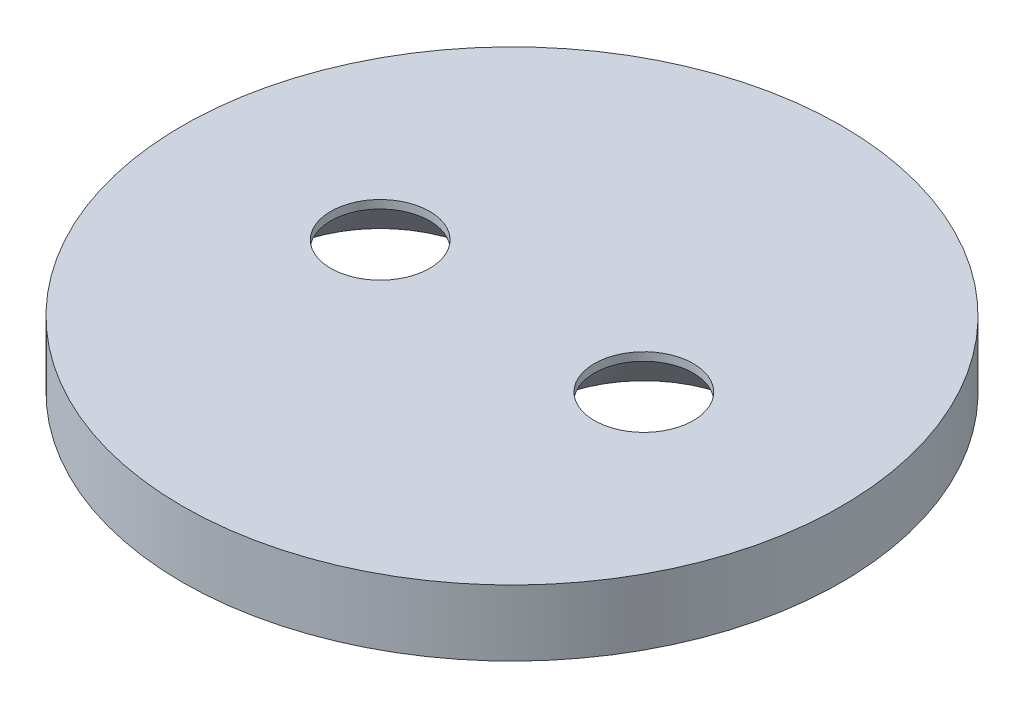
ISO-10303-21;
HEADER;
FILE_DESCRIPTION(('STEP AP214'),'2;1');
FILE_NAME('part.step','',(''),(''),'','','');
FILE_SCHEMA(('AUTOMOTIVE_DESIGN { 1 0 10303 214 1 1 1 1 }'));
ENDSEC;
DATA;
#1=APPLICATION_CONTEXT('core data for automotive mechanical design processes');
#2=APPLICATION_PROTOCOL_DEFINITION('international standard','automotive_design',2000,#1);
#3=PRODUCT_CONTEXT('',#1,'mechanical');
#4=PRODUCT('Part','Part','',(#3));
#5=PRODUCT_RELATED_PRODUCT_CATEGORY('part','',(#4));
#6=PRODUCT_DEFINITION_FORMATION('','',#4);
#7=PRODUCT_DEFINITION_CONTEXT('part definition',#1,'design');
#8=PRODUCT_DEFINITION('design','',#6,#7);
#9=PRODUCT_DEFINITION_SHAPE('','',#8);
#10=(LENGTH_UNIT() NAMED_UNIT(*) SI_UNIT(.MILLI.,.METRE.));
#11=(NAMED_UNIT(*) PLANE_ANGLE_UNIT() SI_UNIT($,.RADIAN.));
#12=(NAMED_UNIT(*) SI_UNIT($,.STERADIAN.) SOLID_ANGLE_UNIT());
#13=UNCERTAINTY_MEASURE_WITH_UNIT(LENGTH_MEASURE(1.E-05),#10,'distance_accuracy_value','');
#14=(GEOMETRIC_REPRESENTATION_CONTEXT(3) GLOBAL_UNCERTAINTY_ASSIGNED_CONTEXT((#13)) GLOBAL_UNIT_ASSIGNED_CONTEXT((#10,
#11,#12)) REPRESENTATION_CONTEXT('',''));
#15=CARTESIAN_POINT('',(0.,0.,0.));
#16=DIRECTION('',(0.,0.,1.));
#17=DIRECTION('',(1.,0.,0.));
#18=AXIS2_PLACEMENT_3D('',#15,#16,#17);
#19=CARTESIAN_POINT('',(0.,2.,0.));
#20=DIRECTION('',(0.,-1.,0.));
#21=DIRECTION('',(0.,0.,-1.));
#22=AXIS2_PLACEMENT_3D('',#19,#20,#21);
#23=CYLINDRICAL_SURFACE('',#22,10.);
#24=CARTESIAN_POINT('',(0.,2.,0.));
#25=DIRECTION('',(0.,1.,0.));
#26=DIRECTION('',(0.,0.,1.));
#27=AXIS2_PLACEMENT_3D('',#24,#25,#26);
#28=CIRCLE('',#27,10.);
#29=CARTESIAN_POINT('',(0.,2.,10.));
#30=VERTEX_POINT('',#29);
#31=EDGE_CURVE('E10',#30,#30,#28,.T.);
#32=ORIENTED_EDGE('',*,*,#31,.F.);
#33=EDGE_LOOP('',(#32));
#34=FACE_BOUND('',#33,.T.);
#35=CARTESIAN_POINT('',(0.,0.,0.));
#36=DIRECTION('',(0.,1.,0.));
#37=DIRECTION('',(0.,0.,1.));
#38=AXIS2_PLACEMENT_3D('',#35,#36,#37);
#39=CIRCLE('',#38,10.);
#40=CARTESIAN_POINT('',(0.,0.,10.));
#41=VERTEX_POINT('',#40);
#42=EDGE_CURVE('E40',#41,#41,#39,.T.);
#43=ORIENTED_EDGE('',*,*,#42,.T.);
#44=EDGE_LOOP('',(#43));
#45=FACE_BOUND('',#44,.T.);
#46=ADVANCED_FACE('F37',(#34,#45),#23,.T.);
#47=CARTESIAN_POINT('',(0.,2.,0.));
#48=DIRECTION('',(0.,1.,0.));
#49=DIRECTION('',(0.,0.,1.));
#50=AXIS2_PLACEMENT_3D('',#47,#48,#49);
#51=PLANE('',#50);
#52=CARTESIAN_POINT('',(4.,2.,0.));
#53=DIRECTION('',(0.,-1.,0.));
#54=DIRECTION('',(0.,0.,-1.));
#55=AXIS2_PLACEMENT_3D('',#52,#53,#54);
#56=CIRCLE('',#55,1.5);
#57=CARTESIAN_POINT('',(4.,2.,-1.5));
#58=VERTEX_POINT('',#57);
#59=EDGE_CURVE('E57',#58,#58,#56,.T.);
#60=ORIENTED_EDGE('',*,*,#59,.T.);
#61=EDGE_LOOP('',(#60));
#62=FACE_BOUND('',#61,.T.);
#63=CARTESIAN_POINT('',(-4.,2.,0.));
#64=DIRECTION('',(0.,-1.,0.));
#65=DIRECTION('',(0.,0.,-1.));
#66=AXIS2_PLACEMENT_3D('',#63,#64,#65);
#67=CIRCLE('',#66,1.5);
#68=CARTESIAN_POINT('',(-4.,2.,-1.5));
#69=VERTEX_POINT('',#68);
#70=EDGE_CURVE('E47',#69,#69,#67,.T.);
#71=ORIENTED_EDGE('',*,*,#70,.T.);
#72=EDGE_LOOP('',(#71));
#73=FACE_BOUND('',#72,.T.);
#74=ORIENTED_EDGE('',*,*,#31,.T.);
#75=EDGE_LOOP('',(#74));
#76=FACE_BOUND('',#75,.T.);
#77=ADVANCED_FACE('F73',(#62,#73,#76),#51,.T.);
#78=CARTESIAN_POINT('',(0.,0.,0.));
#79=DIRECTION('',(0.,1.,0.));
#80=DIRECTION('',(0.,0.,1.));
#81=AXIS2_PLACEMENT_3D('',#78,#79,#80);
#82=PLANE('',#81);
#83=CARTESIAN_POINT('',(4.,0.,0.));
#84=DIRECTION('',(0.,-1.,0.));
#85=DIRECTION('',(0.,0.,-1.));
#86=AXIS2_PLACEMENT_3D('',#83,#84,#85);
#87=CIRCLE('',#86,3.25);
#88=CARTESIAN_POINT('',(4.,0.,-3.25));
#89=VERTEX_POINT('',#88);
#90=EDGE_CURVE('E63',#89,#89,#87,.T.);
#91=ORIENTED_EDGE('',*,*,#90,.F.);
#92=EDGE_LOOP('',(#91));
#93=FACE_BOUND('',#92,.T.);
#94=CARTESIAN_POINT('',(-4.,0.,0.));
#95=DIRECTION('',(0.,-1.,0.));
#96=DIRECTION('',(0.,0.,-1.));
#97=AXIS2_PLACEMENT_3D('',#94,#95,#96);
#98=CIRCLE('',#97,3.25);
#99=CARTESIAN_POINT('',(-4.,0.,-3.25));
#100=VERTEX_POINT('',#99);
#101=EDGE_CURVE('E54',#100,#100,#98,.T.);
#102=ORIENTED_EDGE('',*,*,#101,.F.);
#103=EDGE_LOOP('',(#102));
#104=FACE_BOUND('',#103,.T.);
#105=ORIENTED_EDGE('',*,*,#42,.F.);
#106=EDGE_LOOP('',(#105));
#107=FACE_BOUND('',#106,.T.);
#108=ADVANCED_FACE('F69',(#93,#104,#107),#82,.F.);
#109=CARTESIAN_POINT('',(-4.,0.,0.));
#110=DIRECTION('',(0.,-1.,0.));
#111=DIRECTION('',(0.,0.,-1.));
#112=AXIS2_PLACEMENT_3D('',#109,#110,#111);
#113=CYLINDRICAL_SURFACE('',#112,1.5);
#114=ORIENTED_EDGE('',*,*,#70,.F.);
#115=EDGE_LOOP('',(#114));
#116=FACE_BOUND('',#115,.T.);
#117=CARTESIAN_POINT('',(-4.,1.74999999999999,0.));
#118=DIRECTION('',(0.,-1.,0.));
#119=DIRECTION('',(0.,0.,-1.));
#120=AXIS2_PLACEMENT_3D('',#117,#118,#119);
#121=CIRCLE('',#120,1.5);
#122=CARTESIAN_POINT('',(-4.,1.74999999999999,-1.5));
#123=VERTEX_POINT('',#122);
#124=EDGE_CURVE('E51',#123,#123,#121,.T.);
#125=ORIENTED_EDGE('',*,*,#124,.T.);
#126=EDGE_LOOP('',(#125));
#127=FACE_BOUND('',#126,.T.);
#128=ADVANCED_FACE('F72',(#116,#127),#113,.F.);
#129=CARTESIAN_POINT('',(-4.,0.,0.));
#130=DIRECTION('',(0.,-1.,0.));
#131=DIRECTION('',(0.,0.,-1.));
#132=AXIS2_PLACEMENT_3D('',#129,#130,#131);
#133=CONICAL_SURFACE('',#132,3.25,0.78539816339745);
#134=ORIENTED_EDGE('',*,*,#124,.F.);
#135=EDGE_LOOP('',(#134));
#136=FACE_BOUND('',#135,.T.);
#137=ORIENTED_EDGE('',*,*,#101,.T.);
#138=EDGE_LOOP('',(#137));
#139=FACE_BOUND('',#138,.T.);
#140=ADVANCED_FACE('F91',(#136,#139),#133,.F.);
#141=CARTESIAN_POINT('',(4.,0.,0.));
#142=DIRECTION('',(0.,-1.,0.));
#143=DIRECTION('',(0.,0.,-1.));
#144=AXIS2_PLACEMENT_3D('',#141,#142,#143);
#145=CYLINDRICAL_SURFACE('',#144,1.5);
#146=ORIENTED_EDGE('',*,*,#59,.F.);
#147=EDGE_LOOP('',(#146));
#148=FACE_BOUND('',#147,.T.);
#149=CARTESIAN_POINT('',(4.,1.74999999999999,0.));
#150=DIRECTION('',(0.,-1.,0.));
#151=DIRECTION('',(0.,0.,-1.));
#152=AXIS2_PLACEMENT_3D('',#149,#150,#151);
#153=CIRCLE('',#152,1.5);
#154=CARTESIAN_POINT('',(4.,1.74999999999999,-1.5));
#155=VERTEX_POINT('',#154);
#156=EDGE_CURVE('E60',#155,#155,#153,.T.);
#157=ORIENTED_EDGE('',*,*,#156,.T.);
#158=EDGE_LOOP('',(#157));
#159=FACE_BOUND('',#158,.T.);
#160=ADVANCED_FACE('F95',(#148,#159),#145,.F.);
#161=CARTESIAN_POINT('',(4.,0.,0.));
#162=DIRECTION('',(0.,-1.,0.));
#163=DIRECTION('',(0.,0.,-1.));
#164=AXIS2_PLACEMENT_3D('',#161,#162,#163);
#165=CONICAL_SURFACE('',#164,3.25,0.78539816339745);
#166=ORIENTED_EDGE('',*,*,#156,.F.);
#167=EDGE_LOOP('',(#166));
#168=FACE_BOUND('',#167,.T.);
#169=ORIENTED_EDGE('',*,*,#90,.T.);
#170=EDGE_LOOP('',(#169));
#171=FACE_BOUND('',#170,.T.);
#172=ADVANCED_FACE('F67',(#168,#171),#165,.F.);
#173=CLOSED_SHELL('',(#46,#77,#108,#128,#140,#160,#172));
#174=MANIFOLD_SOLID_BREP('B2',#173);
#175=ADVANCED_BREP_SHAPE_REPRESENTATION('',(#18,#174),#14);
#176=SHAPE_DEFINITION_REPRESENTATION(#9,#175);
ENDSEC;
END-ISO-10303-21;
